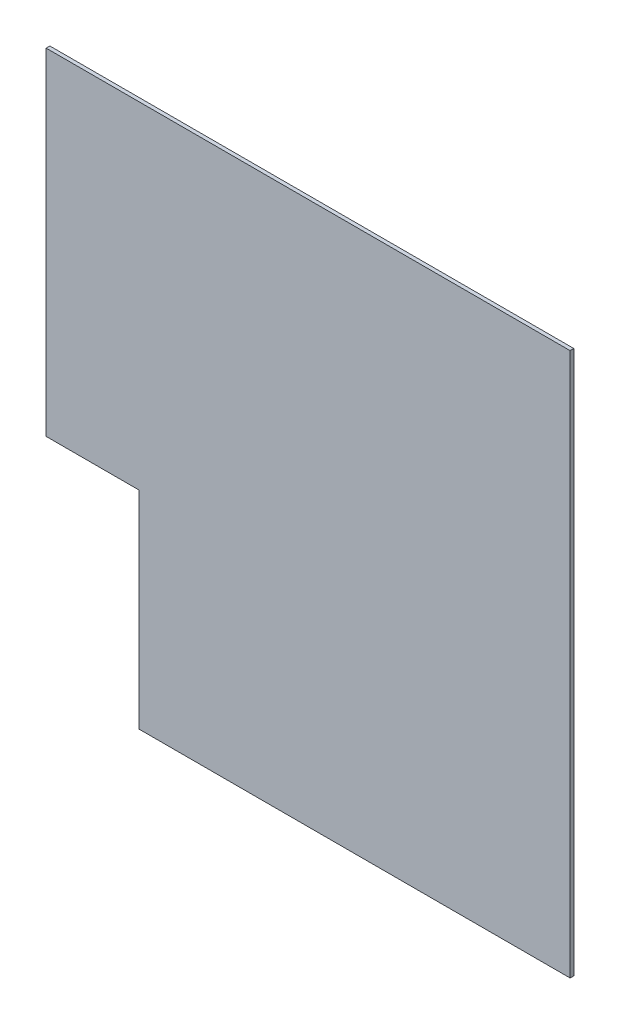
ISO-10303-21;
HEADER;
FILE_DESCRIPTION(('STEP AP214'),'2;1');
FILE_NAME('part.step','',(''),(''),'','','');
FILE_SCHEMA(('AUTOMOTIVE_DESIGN { 1 0 10303 214 1 1 1 1 }'));
ENDSEC;
DATA;
#1=APPLICATION_CONTEXT('core data for automotive mechanical design processes');
#2=APPLICATION_PROTOCOL_DEFINITION('international standard','automotive_design',2000,#1);
#3=PRODUCT_CONTEXT('',#1,'mechanical');
#4=PRODUCT('Part','Part','',(#3));
#5=PRODUCT_RELATED_PRODUCT_CATEGORY('part','',(#4));
#6=PRODUCT_DEFINITION_FORMATION('','',#4);
#7=PRODUCT_DEFINITION_CONTEXT('part definition',#1,'design');
#8=PRODUCT_DEFINITION('design','',#6,#7);
#9=PRODUCT_DEFINITION_SHAPE('','',#8);
#10=(LENGTH_UNIT() NAMED_UNIT(*) SI_UNIT(.MILLI.,.METRE.));
#11=(NAMED_UNIT(*) PLANE_ANGLE_UNIT() SI_UNIT($,.RADIAN.));
#12=(NAMED_UNIT(*) SI_UNIT($,.STERADIAN.) SOLID_ANGLE_UNIT());
#13=UNCERTAINTY_MEASURE_WITH_UNIT(LENGTH_MEASURE(1.E-05),#10,'distance_accuracy_value','');
#14=(GEOMETRIC_REPRESENTATION_CONTEXT(3) GLOBAL_UNCERTAINTY_ASSIGNED_CONTEXT((#13)) GLOBAL_UNIT_ASSIGNED_CONTEXT((#10,
#11,#12)) REPRESENTATION_CONTEXT('',''));
#15=CARTESIAN_POINT('',(0.,0.,0.));
#16=DIRECTION('',(0.,0.,1.));
#17=DIRECTION('',(1.,0.,0.));
#18=AXIS2_PLACEMENT_3D('',#15,#16,#17);
#19=CARTESIAN_POINT('',(510.540787091533,-529.49099097921,6.5));
#20=DIRECTION('',(-1.,0.,0.));
#21=DIRECTION('',(0.,0.,1.));
#22=AXIS2_PLACEMENT_3D('',#19,#20,#21);
#23=PLANE('',#22);
#24=DIRECTION('',(0.,1.,0.));
#25=VECTOR('',#24,1.);
#26=CARTESIAN_POINT('',(510.540787091533,-529.49099097921,0.));
#27=LINE('',#26,#25);
#28=CARTESIAN_POINT('',(510.540787091533,-529.49099097921,0.));
#29=VERTEX_POINT('',#28);
#30=CARTESIAN_POINT('',(510.540787091533,420.50900902079,0.));
#31=VERTEX_POINT('',#30);
#32=EDGE_CURVE('E117',#29,#31,#27,.T.);
#33=ORIENTED_EDGE('',*,*,#32,.T.);
#34=DIRECTION('',(0.,0.,-1.));
#35=VECTOR('',#34,1.);
#36=CARTESIAN_POINT('',(510.540787091533,420.50900902079,6.5));
#37=LINE('',#36,#35);
#38=CARTESIAN_POINT('',(510.540787091533,420.50900902079,6.5));
#39=VERTEX_POINT('',#38);
#40=EDGE_CURVE('E11',#39,#31,#37,.T.);
#41=ORIENTED_EDGE('',*,*,#40,.F.);
#42=DIRECTION('',(0.,1.,0.));
#43=VECTOR('',#42,1.);
#44=CARTESIAN_POINT('',(510.540787091533,-529.49099097921,6.5));
#45=LINE('',#44,#43);
#46=CARTESIAN_POINT('',(510.540787091533,-529.49099097921,6.5));
#47=VERTEX_POINT('',#46);
#48=EDGE_CURVE('E127',#47,#39,#45,.T.);
#49=ORIENTED_EDGE('',*,*,#48,.F.);
#50=DIRECTION('',(0.,0.,-1.));
#51=VECTOR('',#50,1.);
#52=CARTESIAN_POINT('',(510.540787091533,-529.49099097921,6.5));
#53=LINE('',#52,#51);
#54=EDGE_CURVE('E113',#47,#29,#53,.T.);
#55=ORIENTED_EDGE('',*,*,#54,.T.);
#56=EDGE_LOOP('',(#33,#41,#49,#55));
#57=FACE_BOUND('',#56,.T.);
#58=ADVANCED_FACE('F33',(#57),#23,.F.);
#59=CARTESIAN_POINT('',(-405.459212908467,420.50900902079,6.5));
#60=DIRECTION('',(0.,-1.,0.));
#61=DIRECTION('',(0.,0.,-1.));
#62=AXIS2_PLACEMENT_3D('',#59,#60,#61);
#63=PLANE('',#62);
#64=DIRECTION('',(-1.,0.,0.));
#65=VECTOR('',#64,1.);
#66=CARTESIAN_POINT('',(-405.459212908467,420.50900902079,0.));
#67=LINE('',#66,#65);
#68=CARTESIAN_POINT('',(-405.459212908467,420.50900902079,0.));
#69=VERTEX_POINT('',#68);
#70=EDGE_CURVE('E120',#31,#69,#67,.T.);
#71=ORIENTED_EDGE('',*,*,#70,.T.);
#72=DIRECTION('',(0.,0.,-1.));
#73=VECTOR('',#72,1.);
#74=CARTESIAN_POINT('',(-405.459212908467,420.50900902079,6.5));
#75=LINE('',#74,#73);
#76=CARTESIAN_POINT('',(-405.459212908467,420.50900902079,6.5));
#77=VERTEX_POINT('',#76);
#78=EDGE_CURVE('E41',#77,#69,#75,.T.);
#79=ORIENTED_EDGE('',*,*,#78,.F.);
#80=DIRECTION('',(-1.,0.,0.));
#81=VECTOR('',#80,1.);
#82=CARTESIAN_POINT('',(-405.459212908467,420.50900902079,6.5));
#83=LINE('',#82,#81);
#84=EDGE_CURVE('E86',#39,#77,#83,.T.);
#85=ORIENTED_EDGE('',*,*,#84,.F.);
#86=ORIENTED_EDGE('',*,*,#40,.T.);
#87=EDGE_LOOP('',(#71,#79,#85,#86));
#88=FACE_BOUND('',#87,.T.);
#89=ADVANCED_FACE('F151',(#88),#63,.F.);
#90=CARTESIAN_POINT('',(-405.459212908467,-167.49099097921,6.5));
#91=DIRECTION('',(1.,0.,0.));
#92=DIRECTION('',(0.,0.,-1.));
#93=AXIS2_PLACEMENT_3D('',#90,#91,#92);
#94=PLANE('',#93);
#95=DIRECTION('',(0.,-1.,0.));
#96=VECTOR('',#95,1.);
#97=CARTESIAN_POINT('',(-405.459212908467,-167.49099097921,0.));
#98=LINE('',#97,#96);
#99=CARTESIAN_POINT('',(-405.459212908467,-167.49099097921,0.));
#100=VERTEX_POINT('',#99);
#101=EDGE_CURVE('E122',#69,#100,#98,.T.);
#102=ORIENTED_EDGE('',*,*,#101,.T.);
#103=DIRECTION('',(0.,0.,-1.));
#104=VECTOR('',#103,1.);
#105=CARTESIAN_POINT('',(-405.459212908467,-167.49099097921,6.5));
#106=LINE('',#105,#104);
#107=CARTESIAN_POINT('',(-405.459212908467,-167.49099097921,6.5));
#108=VERTEX_POINT('',#107);
#109=EDGE_CURVE('E108',#108,#100,#106,.T.);
#110=ORIENTED_EDGE('',*,*,#109,.F.);
#111=DIRECTION('',(0.,-1.,0.));
#112=VECTOR('',#111,1.);
#113=CARTESIAN_POINT('',(-405.459212908467,-167.49099097921,6.5));
#114=LINE('',#113,#112);
#115=EDGE_CURVE('E99',#77,#108,#114,.T.);
#116=ORIENTED_EDGE('',*,*,#115,.F.);
#117=ORIENTED_EDGE('',*,*,#78,.T.);
#118=EDGE_LOOP('',(#102,#110,#116,#117));
#119=FACE_BOUND('',#118,.T.);
#120=ADVANCED_FACE('F133',(#119),#94,.F.);
#121=CARTESIAN_POINT('',(-405.459212908467,-167.49099097921,6.5));
#122=DIRECTION('',(0.,1.,0.));
#123=DIRECTION('',(0.,0.,1.));
#124=AXIS2_PLACEMENT_3D('',#121,#122,#123);
#125=PLANE('',#124);
#126=DIRECTION('',(1.,0.,0.));
#127=VECTOR('',#126,1.);
#128=CARTESIAN_POINT('',(-405.459212908467,-167.49099097921,0.));
#129=LINE('',#128,#127);
#130=CARTESIAN_POINT('',(-243.459212908467,-167.49099097921,0.));
#131=VERTEX_POINT('',#130);
#132=EDGE_CURVE('E107',#100,#131,#129,.T.);
#133=ORIENTED_EDGE('',*,*,#132,.T.);
#134=DIRECTION('',(0.,0.,-1.));
#135=VECTOR('',#134,1.);
#136=CARTESIAN_POINT('',(-243.459212908467,-167.49099097921,6.5));
#137=LINE('',#136,#135);
#138=CARTESIAN_POINT('',(-243.459212908467,-167.49099097921,6.5));
#139=VERTEX_POINT('',#138);
#140=EDGE_CURVE('E104',#139,#131,#137,.T.);
#141=ORIENTED_EDGE('',*,*,#140,.F.);
#142=DIRECTION('',(1.,0.,0.));
#143=VECTOR('',#142,1.);
#144=CARTESIAN_POINT('',(-405.459212908467,-167.49099097921,6.5));
#145=LINE('',#144,#143);
#146=EDGE_CURVE('E93',#108,#139,#145,.T.);
#147=ORIENTED_EDGE('',*,*,#146,.F.);
#148=ORIENTED_EDGE('',*,*,#109,.T.);
#149=EDGE_LOOP('',(#133,#141,#147,#148));
#150=FACE_BOUND('',#149,.T.);
#151=ADVANCED_FACE('F105',(#150),#125,.F.);
#152=CARTESIAN_POINT('',(-243.459212908467,-167.49099097921,6.5));
#153=DIRECTION('',(1.,0.,0.));
#154=DIRECTION('',(0.,1.,0.));
#155=AXIS2_PLACEMENT_3D('',#152,#153,#154);
#156=PLANE('',#155);
#157=DIRECTION('',(0.,-1.,0.));
#158=VECTOR('',#157,1.);
#159=CARTESIAN_POINT('',(-243.459212908467,-167.49099097921,0.));
#160=LINE('',#159,#158);
#161=CARTESIAN_POINT('',(-243.459212908467,-529.49099097921,0.));
#162=VERTEX_POINT('',#161);
#163=EDGE_CURVE('E72',#131,#162,#160,.T.);
#164=ORIENTED_EDGE('',*,*,#163,.T.);
#165=DIRECTION('',(0.,0.,-1.));
#166=VECTOR('',#165,1.);
#167=CARTESIAN_POINT('',(-243.459212908467,-529.49099097921,6.5));
#168=LINE('',#167,#166);
#169=CARTESIAN_POINT('',(-243.459212908467,-529.49099097921,6.5));
#170=VERTEX_POINT('',#169);
#171=EDGE_CURVE('E109',#170,#162,#168,.T.);
#172=ORIENTED_EDGE('',*,*,#171,.F.);
#173=DIRECTION('',(0.,-1.,0.));
#174=VECTOR('',#173,1.);
#175=CARTESIAN_POINT('',(-243.459212908467,-167.49099097921,6.5));
#176=LINE('',#175,#174);
#177=EDGE_CURVE('E97',#139,#170,#176,.T.);
#178=ORIENTED_EDGE('',*,*,#177,.F.);
#179=ORIENTED_EDGE('',*,*,#140,.T.);
#180=EDGE_LOOP('',(#164,#172,#178,#179));
#181=FACE_BOUND('',#180,.T.);
#182=ADVANCED_FACE('F111',(#181),#156,.F.);
#183=CARTESIAN_POINT('',(-243.459212908467,-529.49099097921,6.5));
#184=DIRECTION('',(0.,1.,0.));
#185=DIRECTION('',(0.,0.,1.));
#186=AXIS2_PLACEMENT_3D('',#183,#184,#185);
#187=PLANE('',#186);
#188=DIRECTION('',(1.,0.,0.));
#189=VECTOR('',#188,1.);
#190=CARTESIAN_POINT('',(-243.459212908467,-529.49099097921,0.));
#191=LINE('',#190,#189);
#192=EDGE_CURVE('E78',#162,#29,#191,.T.);
#193=ORIENTED_EDGE('',*,*,#192,.T.);
#194=ORIENTED_EDGE('',*,*,#54,.F.);
#195=DIRECTION('',(1.,0.,0.));
#196=VECTOR('',#195,1.);
#197=CARTESIAN_POINT('',(-243.459212908467,-529.49099097921,6.5));
#198=LINE('',#197,#196);
#199=EDGE_CURVE('E49',#170,#47,#198,.T.);
#200=ORIENTED_EDGE('',*,*,#199,.F.);
#201=ORIENTED_EDGE('',*,*,#171,.T.);
#202=EDGE_LOOP('',(#193,#194,#200,#201));
#203=FACE_BOUND('',#202,.T.);
#204=ADVANCED_FACE('F140',(#203),#187,.F.);
#205=CARTESIAN_POINT('',(0.,0.,6.5));
#206=DIRECTION('',(0.,0.,-1.));
#207=DIRECTION('',(-1.,0.,0.));
#208=AXIS2_PLACEMENT_3D('',#205,#206,#207);
#209=PLANE('',#208);
#210=ORIENTED_EDGE('',*,*,#48,.T.);
#211=ORIENTED_EDGE('',*,*,#84,.T.);
#212=ORIENTED_EDGE('',*,*,#115,.T.);
#213=ORIENTED_EDGE('',*,*,#146,.T.);
#214=ORIENTED_EDGE('',*,*,#177,.T.);
#215=ORIENTED_EDGE('',*,*,#199,.T.);
#216=EDGE_LOOP('',(#210,#211,#212,#213,#214,#215));
#217=FACE_BOUND('',#216,.T.);
#218=ADVANCED_FACE('F95',(#217),#209,.F.);
#219=CARTESIAN_POINT('',(0.,0.,0.));
#220=DIRECTION('',(0.,0.,-1.));
#221=DIRECTION('',(-1.,0.,0.));
#222=AXIS2_PLACEMENT_3D('',#219,#220,#221);
#223=PLANE('',#222);
#224=ORIENTED_EDGE('',*,*,#32,.F.);
#225=ORIENTED_EDGE('',*,*,#192,.F.);
#226=ORIENTED_EDGE('',*,*,#163,.F.);
#227=ORIENTED_EDGE('',*,*,#132,.F.);
#228=ORIENTED_EDGE('',*,*,#101,.F.);
#229=ORIENTED_EDGE('',*,*,#70,.F.);
#230=EDGE_LOOP('',(#224,#225,#226,#227,#228,#229));
#231=FACE_BOUND('',#230,.T.);
#232=ADVANCED_FACE('F136',(#231),#223,.T.);
#233=CLOSED_SHELL('',(#58,#89,#120,#151,#182,#204,#218,#232));
#234=MANIFOLD_SOLID_BREP('B2',#233);
#235=ADVANCED_BREP_SHAPE_REPRESENTATION('',(#18,#234),#14);
#236=SHAPE_DEFINITION_REPRESENTATION(#9,#235);
ENDSEC;
END-ISO-10303-21;
